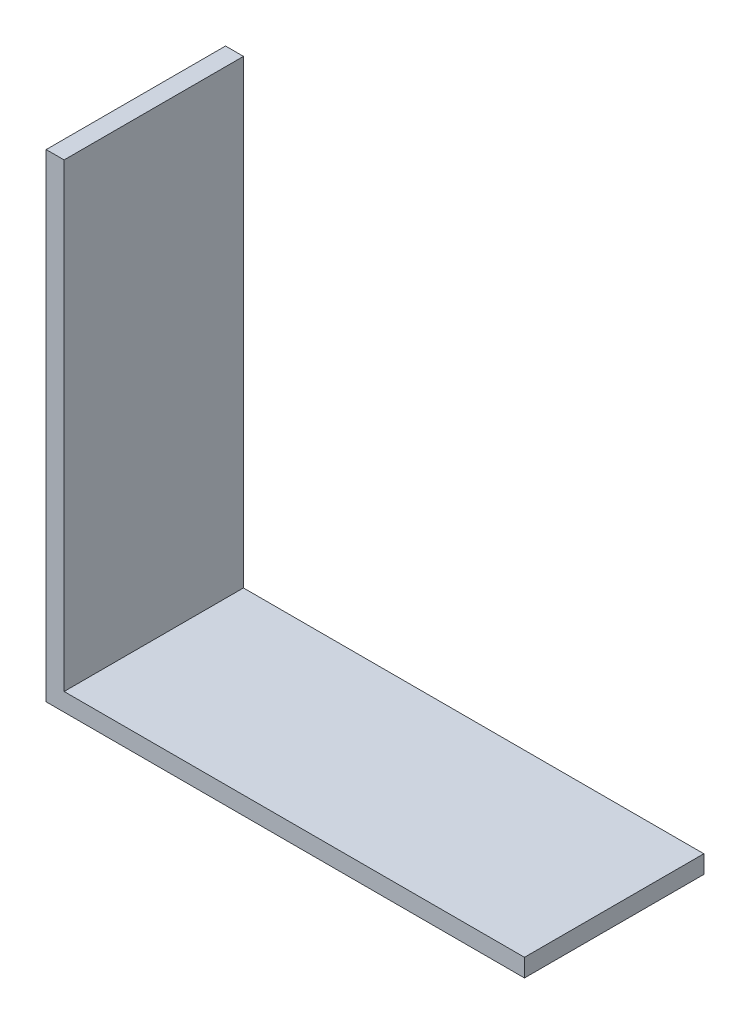
ISO-10303-21;
HEADER;
FILE_DESCRIPTION(('STEP AP214'),'2;1');
FILE_NAME('part.step','',(''),(''),'','','');
FILE_SCHEMA(('AUTOMOTIVE_DESIGN { 1 0 10303 214 1 1 1 1 }'));
ENDSEC;
DATA;
#1=APPLICATION_CONTEXT('core data for automotive mechanical design processes');
#2=APPLICATION_PROTOCOL_DEFINITION('international standard','automotive_design',2000,#1);
#3=PRODUCT_CONTEXT('',#1,'mechanical');
#4=PRODUCT('Part','Part','',(#3));
#5=PRODUCT_RELATED_PRODUCT_CATEGORY('part','',(#4));
#6=PRODUCT_DEFINITION_FORMATION('','',#4);
#7=PRODUCT_DEFINITION_CONTEXT('part definition',#1,'design');
#8=PRODUCT_DEFINITION('design','',#6,#7);
#9=PRODUCT_DEFINITION_SHAPE('','',#8);
#10=(LENGTH_UNIT() NAMED_UNIT(*) SI_UNIT(.MILLI.,.METRE.));
#11=(NAMED_UNIT(*) PLANE_ANGLE_UNIT() SI_UNIT($,.RADIAN.));
#12=(NAMED_UNIT(*) SI_UNIT($,.STERADIAN.) SOLID_ANGLE_UNIT());
#13=UNCERTAINTY_MEASURE_WITH_UNIT(LENGTH_MEASURE(1.E-05),#10,'distance_accuracy_value','');
#14=(GEOMETRIC_REPRESENTATION_CONTEXT(3) GLOBAL_UNCERTAINTY_ASSIGNED_CONTEXT((#13)) GLOBAL_UNIT_ASSIGNED_CONTEXT((#10,
#11,#12)) REPRESENTATION_CONTEXT('',''));
#15=CARTESIAN_POINT('',(0.,0.,0.));
#16=DIRECTION('',(0.,0.,1.));
#17=DIRECTION('',(1.,0.,0.));
#18=AXIS2_PLACEMENT_3D('',#15,#16,#17);
#19=CARTESIAN_POINT('',(0.,40.,15.));
#20=DIRECTION('',(1.,0.,0.));
#21=DIRECTION('',(0.,1.,0.));
#22=AXIS2_PLACEMENT_3D('',#19,#20,#21);
#23=PLANE('',#22);
#24=DIRECTION('',(0.,-1.,0.));
#25=VECTOR('',#24,1.);
#26=CARTESIAN_POINT('',(0.,40.,0.));
#27=LINE('',#26,#25);
#28=CARTESIAN_POINT('',(0.,40.,0.));
#29=VERTEX_POINT('',#28);
#30=CARTESIAN_POINT('',(0.,0.,0.));
#31=VERTEX_POINT('',#30);
#32=EDGE_CURVE('E117',#29,#31,#27,.T.);
#33=ORIENTED_EDGE('',*,*,#32,.T.);
#34=DIRECTION('',(0.,0.,-1.));
#35=VECTOR('',#34,1.);
#36=CARTESIAN_POINT('',(0.,0.,15.));
#37=LINE('',#36,#35);
#38=CARTESIAN_POINT('',(0.,0.,15.));
#39=VERTEX_POINT('',#38);
#40=EDGE_CURVE('E11',#39,#31,#37,.T.);
#41=ORIENTED_EDGE('',*,*,#40,.F.);
#42=DIRECTION('',(0.,-1.,0.));
#43=VECTOR('',#42,1.);
#44=CARTESIAN_POINT('',(0.,40.,15.));
#45=LINE('',#44,#43);
#46=CARTESIAN_POINT('',(0.,40.,15.));
#47=VERTEX_POINT('',#46);
#48=EDGE_CURVE('E127',#47,#39,#45,.T.);
#49=ORIENTED_EDGE('',*,*,#48,.F.);
#50=DIRECTION('',(0.,0.,-1.));
#51=VECTOR('',#50,1.);
#52=CARTESIAN_POINT('',(0.,40.,15.));
#53=LINE('',#52,#51);
#54=EDGE_CURVE('E113',#47,#29,#53,.T.);
#55=ORIENTED_EDGE('',*,*,#54,.T.);
#56=EDGE_LOOP('',(#33,#41,#49,#55));
#57=FACE_BOUND('',#56,.T.);
#58=ADVANCED_FACE('F33',(#57),#23,.F.);
#59=CARTESIAN_POINT('',(0.,0.,15.));
#60=DIRECTION('',(0.,1.,0.));
#61=DIRECTION('',(0.,0.,1.));
#62=AXIS2_PLACEMENT_3D('',#59,#60,#61);
#63=PLANE('',#62);
#64=DIRECTION('',(1.,0.,0.));
#65=VECTOR('',#64,1.);
#66=CARTESIAN_POINT('',(0.,0.,0.));
#67=LINE('',#66,#65);
#68=CARTESIAN_POINT('',(40.,0.,0.));
#69=VERTEX_POINT('',#68);
#70=EDGE_CURVE('E120',#31,#69,#67,.T.);
#71=ORIENTED_EDGE('',*,*,#70,.T.);
#72=DIRECTION('',(0.,0.,-1.));
#73=VECTOR('',#72,1.);
#74=CARTESIAN_POINT('',(40.,0.,15.));
#75=LINE('',#74,#73);
#76=CARTESIAN_POINT('',(40.,0.,15.));
#77=VERTEX_POINT('',#76);
#78=EDGE_CURVE('E41',#77,#69,#75,.T.);
#79=ORIENTED_EDGE('',*,*,#78,.F.);
#80=DIRECTION('',(1.,0.,0.));
#81=VECTOR('',#80,1.);
#82=CARTESIAN_POINT('',(0.,0.,15.));
#83=LINE('',#82,#81);
#84=EDGE_CURVE('E86',#39,#77,#83,.T.);
#85=ORIENTED_EDGE('',*,*,#84,.F.);
#86=ORIENTED_EDGE('',*,*,#40,.T.);
#87=EDGE_LOOP('',(#71,#79,#85,#86));
#88=FACE_BOUND('',#87,.T.);
#89=ADVANCED_FACE('F151',(#88),#63,.F.);
#90=CARTESIAN_POINT('',(40.,0.,15.));
#91=DIRECTION('',(-1.,0.,0.));
#92=DIRECTION('',(0.,0.,1.));
#93=AXIS2_PLACEMENT_3D('',#90,#91,#92);
#94=PLANE('',#93);
#95=DIRECTION('',(0.,1.,0.));
#96=VECTOR('',#95,1.);
#97=CARTESIAN_POINT('',(40.,0.,0.));
#98=LINE('',#97,#96);
#99=CARTESIAN_POINT('',(40.,1.5,0.));
#100=VERTEX_POINT('',#99);
#101=EDGE_CURVE('E122',#69,#100,#98,.T.);
#102=ORIENTED_EDGE('',*,*,#101,.T.);
#103=DIRECTION('',(0.,0.,-1.));
#104=VECTOR('',#103,1.);
#105=CARTESIAN_POINT('',(40.,1.5,15.));
#106=LINE('',#105,#104);
#107=CARTESIAN_POINT('',(40.,1.5,15.));
#108=VERTEX_POINT('',#107);
#109=EDGE_CURVE('E108',#108,#100,#106,.T.);
#110=ORIENTED_EDGE('',*,*,#109,.F.);
#111=DIRECTION('',(0.,1.,0.));
#112=VECTOR('',#111,1.);
#113=CARTESIAN_POINT('',(40.,0.,15.));
#114=LINE('',#113,#112);
#115=EDGE_CURVE('E99',#77,#108,#114,.T.);
#116=ORIENTED_EDGE('',*,*,#115,.F.);
#117=ORIENTED_EDGE('',*,*,#78,.T.);
#118=EDGE_LOOP('',(#102,#110,#116,#117));
#119=FACE_BOUND('',#118,.T.);
#120=ADVANCED_FACE('F133',(#119),#94,.F.);
#121=CARTESIAN_POINT('',(40.,1.5,15.));
#122=DIRECTION('',(0.,-1.,0.));
#123=DIRECTION('',(1.,0.,0.));
#124=AXIS2_PLACEMENT_3D('',#121,#122,#123);
#125=PLANE('',#124);
#126=DIRECTION('',(-1.,0.,0.));
#127=VECTOR('',#126,1.);
#128=CARTESIAN_POINT('',(40.,1.5,0.));
#129=LINE('',#128,#127);
#130=CARTESIAN_POINT('',(1.5,1.5,0.));
#131=VERTEX_POINT('',#130);
#132=EDGE_CURVE('E107',#100,#131,#129,.T.);
#133=ORIENTED_EDGE('',*,*,#132,.T.);
#134=DIRECTION('',(0.,0.,-1.));
#135=VECTOR('',#134,1.);
#136=CARTESIAN_POINT('',(1.5,1.5,15.));
#137=LINE('',#136,#135);
#138=CARTESIAN_POINT('',(1.5,1.5,15.));
#139=VERTEX_POINT('',#138);
#140=EDGE_CURVE('E104',#139,#131,#137,.T.);
#141=ORIENTED_EDGE('',*,*,#140,.F.);
#142=DIRECTION('',(-1.,0.,0.));
#143=VECTOR('',#142,1.);
#144=CARTESIAN_POINT('',(40.,1.5,15.));
#145=LINE('',#144,#143);
#146=EDGE_CURVE('E93',#108,#139,#145,.T.);
#147=ORIENTED_EDGE('',*,*,#146,.F.);
#148=ORIENTED_EDGE('',*,*,#109,.T.);
#149=EDGE_LOOP('',(#133,#141,#147,#148));
#150=FACE_BOUND('',#149,.T.);
#151=ADVANCED_FACE('F105',(#150),#125,.F.);
#152=CARTESIAN_POINT('',(1.5,1.5,15.));
#153=DIRECTION('',(-1.,0.,0.));
#154=DIRECTION('',(0.,-1.,0.));
#155=AXIS2_PLACEMENT_3D('',#152,#153,#154);
#156=PLANE('',#155);
#157=DIRECTION('',(0.,1.,0.));
#158=VECTOR('',#157,1.);
#159=CARTESIAN_POINT('',(1.5,1.5,0.));
#160=LINE('',#159,#158);
#161=CARTESIAN_POINT('',(1.5,40.,0.));
#162=VERTEX_POINT('',#161);
#163=EDGE_CURVE('E72',#131,#162,#160,.T.);
#164=ORIENTED_EDGE('',*,*,#163,.T.);
#165=DIRECTION('',(0.,0.,-1.));
#166=VECTOR('',#165,1.);
#167=CARTESIAN_POINT('',(1.5,40.,15.));
#168=LINE('',#167,#166);
#169=CARTESIAN_POINT('',(1.5,40.,15.));
#170=VERTEX_POINT('',#169);
#171=EDGE_CURVE('E109',#170,#162,#168,.T.);
#172=ORIENTED_EDGE('',*,*,#171,.F.);
#173=DIRECTION('',(0.,1.,0.));
#174=VECTOR('',#173,1.);
#175=CARTESIAN_POINT('',(1.5,1.5,15.));
#176=LINE('',#175,#174);
#177=EDGE_CURVE('E97',#139,#170,#176,.T.);
#178=ORIENTED_EDGE('',*,*,#177,.F.);
#179=ORIENTED_EDGE('',*,*,#140,.T.);
#180=EDGE_LOOP('',(#164,#172,#178,#179));
#181=FACE_BOUND('',#180,.T.);
#182=ADVANCED_FACE('F111',(#181),#156,.F.);
#183=CARTESIAN_POINT('',(1.5,40.,15.));
#184=DIRECTION('',(0.,-1.,0.));
#185=DIRECTION('',(0.,0.,-1.));
#186=AXIS2_PLACEMENT_3D('',#183,#184,#185);
#187=PLANE('',#186);
#188=DIRECTION('',(-1.,0.,0.));
#189=VECTOR('',#188,1.);
#190=CARTESIAN_POINT('',(1.5,40.,0.));
#191=LINE('',#190,#189);
#192=EDGE_CURVE('E78',#162,#29,#191,.T.);
#193=ORIENTED_EDGE('',*,*,#192,.T.);
#194=ORIENTED_EDGE('',*,*,#54,.F.);
#195=DIRECTION('',(-1.,0.,0.));
#196=VECTOR('',#195,1.);
#197=CARTESIAN_POINT('',(1.5,40.,15.));
#198=LINE('',#197,#196);
#199=EDGE_CURVE('E49',#170,#47,#198,.T.);
#200=ORIENTED_EDGE('',*,*,#199,.F.);
#201=ORIENTED_EDGE('',*,*,#171,.T.);
#202=EDGE_LOOP('',(#193,#194,#200,#201));
#203=FACE_BOUND('',#202,.T.);
#204=ADVANCED_FACE('F140',(#203),#187,.F.);
#205=CARTESIAN_POINT('',(0.,0.,15.));
#206=DIRECTION('',(0.,0.,1.));
#207=DIRECTION('',(1.,0.,0.));
#208=AXIS2_PLACEMENT_3D('',#205,#206,#207);
#209=PLANE('',#208);
#210=ORIENTED_EDGE('',*,*,#48,.T.);
#211=ORIENTED_EDGE('',*,*,#84,.T.);
#212=ORIENTED_EDGE('',*,*,#115,.T.);
#213=ORIENTED_EDGE('',*,*,#146,.T.);
#214=ORIENTED_EDGE('',*,*,#177,.T.);
#215=ORIENTED_EDGE('',*,*,#199,.T.);
#216=EDGE_LOOP('',(#210,#211,#212,#213,#214,#215));
#217=FACE_BOUND('',#216,.T.);
#218=ADVANCED_FACE('F95',(#217),#209,.T.);
#219=CARTESIAN_POINT('',(0.,0.,0.));
#220=DIRECTION('',(0.,0.,1.));
#221=DIRECTION('',(1.,0.,0.));
#222=AXIS2_PLACEMENT_3D('',#219,#220,#221);
#223=PLANE('',#222);
#224=ORIENTED_EDGE('',*,*,#32,.F.);
#225=ORIENTED_EDGE('',*,*,#192,.F.);
#226=ORIENTED_EDGE('',*,*,#163,.F.);
#227=ORIENTED_EDGE('',*,*,#132,.F.);
#228=ORIENTED_EDGE('',*,*,#101,.F.);
#229=ORIENTED_EDGE('',*,*,#70,.F.);
#230=EDGE_LOOP('',(#224,#225,#226,#227,#228,#229));
#231=FACE_BOUND('',#230,.T.);
#232=ADVANCED_FACE('F136',(#231),#223,.F.);
#233=CLOSED_SHELL('',(#58,#89,#120,#151,#182,#204,#218,#232));
#234=MANIFOLD_SOLID_BREP('B2',#233);
#235=ADVANCED_BREP_SHAPE_REPRESENTATION('',(#18,#234),#14);
#236=SHAPE_DEFINITION_REPRESENTATION(#9,#235);
ENDSEC;
END-ISO-10303-21;
